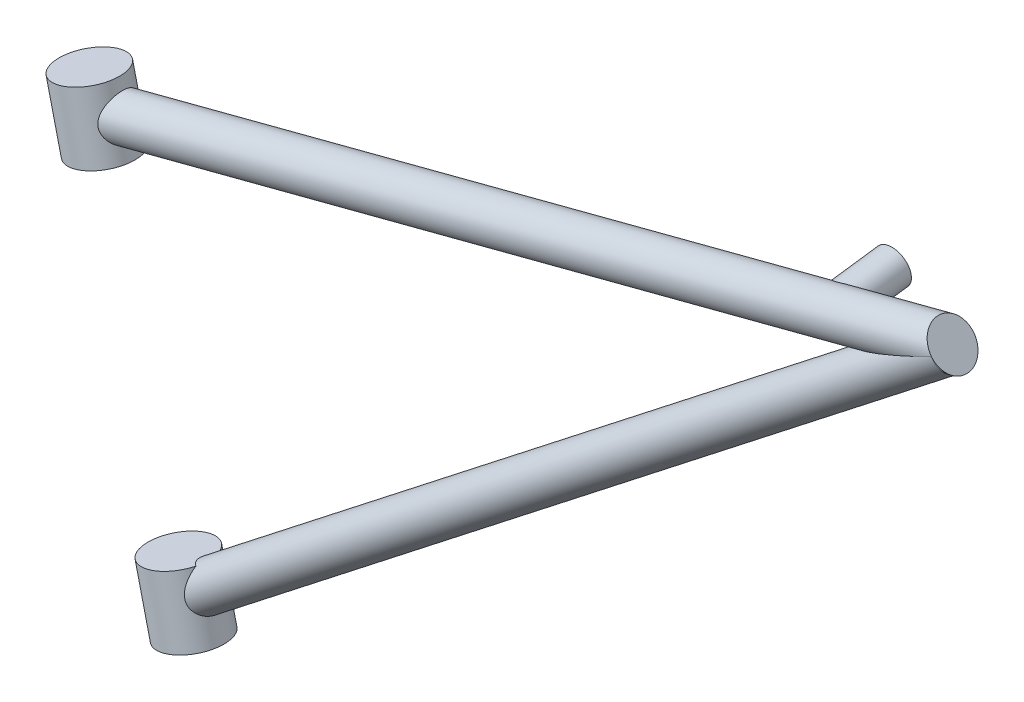
ISO-10303-21;
HEADER;
FILE_DESCRIPTION(('STEP AP214'),'2;1');
FILE_NAME('part.step','',(''),(''),'','','');
FILE_SCHEMA(('AUTOMOTIVE_DESIGN { 1 0 10303 214 1 1 1 1 }'));
ENDSEC;
DATA;
#1=APPLICATION_CONTEXT('core data for automotive mechanical design processes');
#2=APPLICATION_PROTOCOL_DEFINITION('international standard','automotive_design',2000,#1);
#3=PRODUCT_CONTEXT('',#1,'mechanical');
#4=PRODUCT('Part','Part','',(#3));
#5=PRODUCT_RELATED_PRODUCT_CATEGORY('part','',(#4));
#6=PRODUCT_DEFINITION_FORMATION('','',#4);
#7=PRODUCT_DEFINITION_CONTEXT('part definition',#1,'design');
#8=PRODUCT_DEFINITION('design','',#6,#7);
#9=PRODUCT_DEFINITION_SHAPE('','',#8);
#10=(LENGTH_UNIT() NAMED_UNIT(*) SI_UNIT(.MILLI.,.METRE.));
#11=(NAMED_UNIT(*) PLANE_ANGLE_UNIT() SI_UNIT($,.RADIAN.));
#12=(NAMED_UNIT(*) SI_UNIT($,.STERADIAN.) SOLID_ANGLE_UNIT());
#13=UNCERTAINTY_MEASURE_WITH_UNIT(LENGTH_MEASURE(1.E-05),#10,'distance_accuracy_value','');
#14=(GEOMETRIC_REPRESENTATION_CONTEXT(3) GLOBAL_UNCERTAINTY_ASSIGNED_CONTEXT((#13)) GLOBAL_UNIT_ASSIGNED_CONTEXT((#10,
#11,#12)) REPRESENTATION_CONTEXT('',''));
#15=CARTESIAN_POINT('',(0.,0.,0.));
#16=DIRECTION('',(0.,0.,1.));
#17=DIRECTION('',(1.,0.,0.));
#18=AXIS2_PLACEMENT_3D('',#15,#16,#17);
#19=CARTESIAN_POINT('',(215.,1151.6011,-53.649));
#20=DIRECTION('',(0.788508643665139,0.615015858971912,-0.00310033520835739));
#21=DIRECTION('',(-0.615018814783549,0.788512433295911,0.));
#22=AXIS2_PLACEMENT_3D('',#19,#20,#21);
#23=CYLINDRICAL_SURFACE('',#22,9.525);
#24=CARTESIAN_POINT('',(243.39562055654,1173.74893199642,-53.7606486710474));
#25=DIRECTION('',(-0.230684760062267,0.973028498209276,0.000288353283411398));
#26=DIRECTION('',(0.973022198051878,0.230684316193179,-0.00354236655039736));
#27=AXIS2_PLACEMENT_3D('',#24,#25,#26);
#28=ELLIPSE('',#27,22.8674930535986,9.525);
#29=CARTESIAN_POINT('',(224.320634321341,1169.225180437,-48.7995007985226));
#30=VERTEX_POINT('',#29);
#31=CARTESIAN_POINT('',(224.286262085042,1169.21993073521,-58.5827833271125));
#32=VERTEX_POINT('',#31);
#33=EDGE_CURVE('E105',#30,#32,#28,.F.);
#34=ORIENTED_EDGE('',*,*,#33,.F.);
#35=CARTESIAN_POINT('',(224.286262085042,1169.21993073521,-58.5827833271125));
#36=CARTESIAN_POINT('',(224.259857325888,1169.08518369756,-58.7334222265341));
#37=CARTESIAN_POINT('',(224.233039669883,1168.94604086328,-58.8799868131545));
#38=CARTESIAN_POINT('',(224.178991820654,1168.65996638962,-59.1650957687113));
#39=CARTESIAN_POINT('',(224.151761828018,1168.51303845566,-59.3036438886452));
#40=CARTESIAN_POINT('',(224.097330416037,1168.2125631291,-59.5727254876107));
#41=CARTESIAN_POINT('',(224.070129045662,1168.05902930883,-59.7032741781378));
#42=CARTESIAN_POINT('',(224.01607745269,1167.74582344913,-59.9568762347867));
#43=CARTESIAN_POINT('',(223.989227276873,1167.5861506029,-60.0799286101978));
#44=CARTESIAN_POINT('',(223.909708784618,1167.09862159596,-60.4383869338368));
#45=CARTESIAN_POINT('',(223.858116884653,1166.76249561412,-60.6628811966612));
#46=CARTESIAN_POINT('',(223.760795592024,1166.07242209011,-61.0842061784766));
#47=CARTESIAN_POINT('',(223.715069350101,1165.718465111,-61.2810220354276));
#48=CARTESIAN_POINT('',(223.636664786251,1165.0304754153,-61.6302543273577));
#49=CARTESIAN_POINT('',(223.603156724985,1164.69777584187,-61.7851169950369));
#50=CARTESIAN_POINT('',(223.546313161637,1164.02225456936,-62.0730099883752));
#51=CARTESIAN_POINT('',(223.522976398826,1163.67943413039,-62.2060430185345));
#52=CARTESIAN_POINT('',(223.489676812072,1162.9854248798,-62.4497650608225));
#53=CARTESIAN_POINT('',(223.479707198136,1162.63424040913,-62.5604653927971));
#54=CARTESIAN_POINT('',(223.476895189122,1161.92538048244,-62.7582826238399));
#55=CARTESIAN_POINT('',(223.484046705598,1161.56770737875,-62.8454078941737));
#56=CARTESIAN_POINT('',(223.526129800851,1160.72354013421,-63.019632003482));
#57=CARTESIAN_POINT('',(223.569782905443,1160.23511607562,-63.0963815878199));
#58=CARTESIAN_POINT('',(223.673039754559,1159.50421169317,-63.1703509628201));
#59=CARTESIAN_POINT('',(223.713721858204,1159.26100004498,-63.1881497714082));
#60=CARTESIAN_POINT('',(223.808925405596,1158.77656784518,-63.208784261346));
#61=CARTESIAN_POINT('',(223.863446913944,1158.53534730287,-63.21161987285));
#62=CARTESIAN_POINT('',(223.987999226804,1158.0538387664,-63.2009379730411));
#63=CARTESIAN_POINT('',(224.058226605981,1157.81360581606,-63.1872025274816));
#64=CARTESIAN_POINT('',(224.213948087072,1157.33984142985,-63.1417799374408));
#65=CARTESIAN_POINT('',(224.299441506856,1157.10630969509,-63.1100935949197));
#66=CARTESIAN_POINT('',(224.484918597031,1156.64861619958,-63.0279072957908));
#67=CARTESIAN_POINT('',(224.584894816063,1156.4244496964,-62.97741699291));
#68=CARTESIAN_POINT('',(224.797681142944,1155.98766669081,-62.8572366265394));
#69=CARTESIAN_POINT('',(224.910489960448,1155.77504903031,-62.7875484924329));
#70=CARTESIAN_POINT('',(225.128165273432,1155.39502394416,-62.6414190706142));
#71=CARTESIAN_POINT('',(225.231556877416,1155.22571379616,-62.5676942871559));
#72=CARTESIAN_POINT('',(225.44401194002,1154.8971588129,-62.406965429258));
#73=CARTESIAN_POINT('',(225.553077604184,1154.73791794574,-62.319956165241));
#74=CARTESIAN_POINT('',(225.775019094641,1154.42987011107,-62.1331560767408));
#75=CARTESIAN_POINT('',(225.887896113201,1154.28106645417,-62.0333612248764));
#76=CARTESIAN_POINT('',(226.115608918504,1153.99398465869,-61.8215969051118));
#77=CARTESIAN_POINT('',(226.230444940643,1153.85570779608,-61.7096259653097));
#78=CARTESIAN_POINT('',(226.46640898153,1153.58252515966,-61.4679271119184));
#79=CARTESIAN_POINT('',(226.587548762974,1153.44818382824,-61.337573472335));
#80=CARTESIAN_POINT('',(226.82820128942,1153.19075081337,-61.0648374828117));
#81=CARTESIAN_POINT('',(226.947714016948,1153.06765925064,-60.9224550038083));
#82=CARTESIAN_POINT('',(227.183456996661,1152.83235048838,-60.6263657424205));
#83=CARTESIAN_POINT('',(227.29968645648,1152.72013589822,-60.4726562581964));
#84=CARTESIAN_POINT('',(227.527315519424,1152.50626944914,-60.1546736029061));
#85=CARTESIAN_POINT('',(227.63871480492,1152.40461828425,-59.9903997388923));
#86=CARTESIAN_POINT('',(227.873123418797,1152.19569467397,-59.6241829279834));
#87=CARTESIAN_POINT('',(227.995029525822,1152.09024665705,-59.4204877809454));
#88=CARTESIAN_POINT('',(228.228473609432,1151.89287255824,-59.000949780285));
#89=CARTESIAN_POINT('',(228.340010636346,1151.80094771444,-58.7851058168927));
#90=CARTESIAN_POINT('',(228.551008201797,1151.63032006214,-58.3424633826018));
#91=CARTESIAN_POINT('',(228.650465034046,1151.55162130866,-58.1156615794439));
#92=CARTESIAN_POINT('',(228.83572510005,1151.40730238531,-57.6525195071222));
#93=CARTESIAN_POINT('',(228.92152837014,1151.34168218063,-57.416179263345));
#94=CARTESIAN_POINT('',(229.081485830094,1151.22090349209,-56.9251846859305));
#95=CARTESIAN_POINT('',(229.154989456591,1151.16630857725,-56.6701789396034));
#96=CARTESIAN_POINT('',(229.284460401839,1151.07117985988,-56.1531731303483));
#97=CARTESIAN_POINT('',(229.340427068882,1151.0306465799,-55.8911728078801));
#98=CARTESIAN_POINT('',(229.433846047649,1150.963646173,-55.3621714159013));
#99=CARTESIAN_POINT('',(229.471302148862,1150.93717616695,-55.0951713815594));
#100=CARTESIAN_POINT('',(229.527062363931,1150.89830263798,-54.5581687493097));
#101=CARTESIAN_POINT('',(229.545367263428,1150.88589853803,-54.2881662750304));
#102=CARTESIAN_POINT('',(229.562199853024,1150.87535932399,-53.7571259945295));
#103=CARTESIAN_POINT('',(229.561423639708,1150.87672092083,-53.4961198833487));
#104=CARTESIAN_POINT('',(229.54182225614,1150.89250809807,-52.9751874948947));
#105=CARTESIAN_POINT('',(229.522997505866,1150.9069333745,-52.7152611926364));
#106=CARTESIAN_POINT('',(229.467621648065,1150.94883442944,-52.198393218211));
#107=CARTESIAN_POINT('',(229.431072078148,1150.97630907593,-51.9414512891322));
#108=CARTESIAN_POINT('',(229.340854163361,1151.04429691626,-51.4323457186929));
#109=CARTESIAN_POINT('',(229.287185724139,1151.08481018195,-51.1801821036765));
#110=CARTESIAN_POINT('',(229.164114514175,1151.17849155133,-50.684408224491));
#111=CARTESIAN_POINT('',(229.094844818259,1151.23155280478,-50.4407446602848));
#112=CARTESIAN_POINT('',(228.941420982296,1151.35054264559,-49.9613837856289));
#113=CARTESIAN_POINT('',(228.857266934708,1151.41647115302,-49.7256864257047));
#114=CARTESIAN_POINT('',(228.675340927335,1151.56132618532,-49.2636028445119));
#115=CARTESIAN_POINT('',(228.577562843186,1151.64025855868,-49.0372208703685));
#116=CARTESIAN_POINT('',(228.369929673435,1151.81127984121,-48.5952204581985));
#117=CARTESIAN_POINT('',(228.260074308572,1151.90336905461,-48.379602269228));
#118=CARTESIAN_POINT('',(228.025641852722,1152.10472360081,-47.9524464985806));
#119=CARTESIAN_POINT('',(227.900664970458,1152.2145070493,-47.7413721247286));
#120=CARTESIAN_POINT('',(227.641692170489,1152.44898572412,-47.3334870610304));
#121=CARTESIAN_POINT('',(227.507695538429,1152.57368213214,-47.1366775035155));
#122=CARTESIAN_POINT('',(227.233168220124,1152.83848396559,-46.7586981138108));
#123=CARTESIAN_POINT('',(227.092639522964,1152.97858471773,-46.5775235679732));
#124=CARTESIAN_POINT('',(226.807776868606,1153.27482164288,-46.2320765009033));
#125=CARTESIAN_POINT('',(226.663443626362,1153.43095481881,-46.0678008320655));
#126=CARTESIAN_POINT('',(226.398381649131,1153.73220035553,-45.7835229472519));
#127=CARTESIAN_POINT('',(226.277756793015,1153.87476454738,-45.6607174563726));
#128=CARTESIAN_POINT('',(226.038026162807,1154.17157832639,-45.4284949783267));
#129=CARTESIAN_POINT('',(225.918920107725,1154.3258257143,-45.3190754814821));
#130=CARTESIAN_POINT('',(225.68447363856,1154.64583511665,-45.1144618249629));
#131=CARTESIAN_POINT('',(225.56912892202,1154.81158324434,-45.0192509321473));
#132=CARTESIAN_POINT('',(225.344231202539,1155.15444321128,-44.8435327087651));
#133=CARTESIAN_POINT('',(225.234678188904,1155.33155502955,-44.7630253510501));
#134=CARTESIAN_POINT('',(225.022918953883,1155.69734784393,-44.6167956848934));
#135=CARTESIAN_POINT('',(224.920752853279,1155.8860830084,-44.5511505102988));
#136=CARTESIAN_POINT('',(224.726236552822,1156.2731161268,-44.4353515205439));
#137=CARTESIAN_POINT('',(224.633885981681,1156.47141371862,-44.3851971192857));
#138=CARTESIAN_POINT('',(224.460378084522,1156.87601236501,-44.3002130778941));
#139=CARTESIAN_POINT('',(224.379220459273,1157.08231320545,-44.2653830280258));
#140=CARTESIAN_POINT('',(224.228871364813,1157.50114234092,-44.2105340427636));
#141=CARTESIAN_POINT('',(224.159681129355,1157.71367127539,-44.1905166337503));
#142=CARTESIAN_POINT('',(224.024758252432,1158.17268394055,-44.1627261198933));
#143=CARTESIAN_POINT('',(223.960810831434,1158.41981650712,-44.1570163817677));
#144=CARTESIAN_POINT('',(223.84806207577,1158.9173015926,-44.1623562048332));
#145=CARTESIAN_POINT('',(223.799263220286,1159.16765463159,-44.173408507524));
#146=CARTESIAN_POINT('',(223.715527415159,1159.6701047542,-44.2108590866441));
#147=CARTESIAN_POINT('',(223.680624287529,1159.92220459189,-44.2372944252073));
#148=CARTESIAN_POINT('',(223.623333552202,1160.42599160862,-44.3041988677007));
#149=CARTESIAN_POINT('',(223.600950420562,1160.67767860805,-44.3446729823029));
#150=CARTESIAN_POINT('',(223.558780297688,1161.30287687313,-44.4616078378177));
#151=CARTESIAN_POINT('',(223.545694317176,1161.67537289618,-44.5459758038928));
#152=CARTESIAN_POINT('',(223.538808081783,1162.41371197458,-44.7406100397313));
#153=CARTESIAN_POINT('',(223.545016437151,1162.77955198637,-44.8508878516685));
#154=CARTESIAN_POINT('',(223.572366659079,1163.50269049958,-45.0957872402616));
#155=CARTESIAN_POINT('',(223.593520155094,1163.85998212515,-45.230427713817));
#156=CARTESIAN_POINT('',(223.647104845075,1164.56390081036,-45.523302583792));
#157=CARTESIAN_POINT('',(223.679537190931,1164.9105267768,-45.6815393891229));
#158=CARTESIAN_POINT('',(223.756030086726,1165.62330036858,-46.0377397506442));
#159=CARTESIAN_POINT('',(223.800900330001,1165.98819350736,-46.238045206054));
#160=CARTESIAN_POINT('',(223.896881081983,1166.69941202241,-46.6677952406542));
#161=CARTESIAN_POINT('',(223.947988032294,1167.04574782584,-46.897223206772));
#162=CARTESIAN_POINT('',(224.026816912979,1167.5476009186,-47.2640278767862));
#163=CARTESIAN_POINT('',(224.053423020627,1167.7117661915,-47.3899166807251));
#164=CARTESIAN_POINT('',(224.106979674164,1168.03368651719,-47.6495584858503));
#165=CARTESIAN_POINT('',(224.133930170897,1168.19144247162,-47.7833103743365));
#166=CARTESIAN_POINT('',(224.187824471542,1168.5000637803,-48.0591988432474));
#167=CARTESIAN_POINT('',(224.214768147409,1168.65091427743,-48.2013521213038));
#168=CARTESIAN_POINT('',(224.268174197067,1168.94444836238,-48.494074583859));
#169=CARTESIAN_POINT('',(224.294636321789,1169.08712780152,-48.6446479681439));
#170=CARTESIAN_POINT('',(224.320634321341,1169.225180437,-48.7995007985225));
#171=B_SPLINE_CURVE_WITH_KNOTS('',3,(#35,#36,#37,#38,#39,#40,#41,#42,#43,#44,#45,#46,#47,#48,
#49,#50,#51,#52,#53,#54,#55,#56,#57,#58,#59,#60,#61,#62,#63,#64,#65,#66,#67,#68,#69,#70,#71,#72,
#73,#74,#75,#76,#77,#78,#79,#80,#81,#82,#83,#84,#85,#86,#87,#88,#89,#90,#91,#92,#93,#94,#95,#96,
#97,#98,#99,#100,#101,#102,#103,#104,#105,#106,#107,#108,#109,#110,#111,#112,#113,#114,#115,
#116,#117,#118,#119,#120,#121,#122,#123,#124,#125,#126,#127,#128,#129,#130,#131,#132,#133,#134,
#135,#136,#137,#138,#139,#140,#141,#142,#143,#144,#145,#146,#147,#148,#149,#150,#151,#152,#153,
#154,#155,#156,#157,#158,#159,#160,#161,#162,#163,#164,#165,#166,#167,#168,#169,#170),
.UNSPECIFIED.,.F.,.F.,(4,2,2,2,2,2,2,2,2,2,2,2,2,2,2,2,2,2,2,2,2,2,2,2,2,2,2,2,2,2,2,2,2,2,2,2,
2,2,2,2,2,2,2,2,2,2,2,2,2,2,2,2,2,2,2,2,2,2,2,2,2,2,2,2,2,2,2,4),(0.,0.611321113095535,
1.22235382943916,1.83218605530848,2.44209870234858,3.66289333627033,4.88434099855862,
5.98894252437597,7.09340709627896,8.19731043031264,9.30082126350922,10.7844934193151,
11.5255072719035,12.2665245834173,13.0173945439189,13.7682309617921,14.5186824394657,
15.2690585242179,15.9032452299519,16.5376803173909,17.172315741574,17.8070279688859,
18.4752867183988,19.1435526389087,19.8119784806391,20.48044821112,21.2588433186672,
22.0373096468024,22.8160142137429,23.5947167082835,24.4065344178049,25.2183822925518,
26.030063896594,26.8417122016533,27.6237962912566,28.4058621827752,29.1878602430734,
29.9698626134922,30.7454316380738,31.5209958450605,32.296909820138,33.0728417402577,
33.8781372588609,34.6834966314204,35.4886123495505,36.2935778332748,36.963445893815,
37.6331881707954,38.3021353757178,38.971081345498,39.6434233396011,40.3157398923394,
40.9880384679269,41.6604063114264,42.4252747618274,43.19026832305,43.9571126486434,
44.7242309558053,45.8689446439783,47.0141692429464,48.1602859732016,49.3065197888626,
50.561168015951,51.8151037127786,52.4406454213909,53.0660988220636,53.6928400783572,
54.3198967787742),.UNSPECIFIED.);
#172=EDGE_CURVE('E92',#32,#30,#171,.T.);
#173=ORIENTED_EDGE('',*,*,#172,.F.);
#174=EDGE_LOOP('',(#34,#173));
#175=FACE_BOUND('',#174,.T.);
#176=CARTESIAN_POINT('',(558.599999999999,1419.6,-55.));
#177=DIRECTION('',(0.897008226583714,0.442000857679935,-0.00338869463695132));
#178=DIRECTION('',(-0.441999884452041,0.897014466927656,0.00107157215105032));
#179=AXIS2_PLACEMENT_3D('',#176,#177,#178);
#180=ELLIPSE('',#179,9.72785711197768,9.525);
#181=CARTESIAN_POINT('',(558.633464600869,1419.60511105407,-45.4750601577955));
#182=VERTEX_POINT('',#181);
#183=CARTESIAN_POINT('',(558.566535399132,1419.59488894593,-64.5249398422045));
#184=VERTEX_POINT('',#183);
#185=EDGE_CURVE('E99',#182,#184,#180,.T.);
#186=ORIENTED_EDGE('',*,*,#185,.F.);
#187=CARTESIAN_POINT('',(558.599999999999,1419.6,-55.));
#188=DIRECTION('',(-0.441999884452041,0.897014466927656,0.00107157215105032));
#189=DIRECTION('',(0.897008226583714,0.442000857679935,-0.00338869463695132));
#190=AXIS2_PLACEMENT_3D('',#187,#188,#189);
#191=ELLIPSE('',#190,46.8855974220386,9.525);
#192=EDGE_CURVE('E127',#184,#182,#191,.T.);
#193=ORIENTED_EDGE('',*,*,#192,.F.);
#194=EDGE_LOOP('',(#186,#193));
#195=FACE_BOUND('',#194,.T.);
#196=ADVANCED_FACE('F73',(#175,#195),#23,.T.);
#197=CARTESIAN_POINT('',(175.,1320.3211,-53.599));
#198=DIRECTION('',(0.968096795715719,0.250551577091192,-0.00353572369863849));
#199=DIRECTION('',(-0.250553143221362,0.968102847027058,0.));
#200=AXIS2_PLACEMENT_3D('',#197,#198,#199);
#201=CYLINDRICAL_SURFACE('',#200,9.525);
#202=CARTESIAN_POINT('',(504.227133417646,1414.08844154874,-59.5039585938913));
#203=CARTESIAN_POINT('',(504.464857421224,1414.09760181344,-59.5942617891076));
#204=CARTESIAN_POINT('',(504.698635246343,1414.09704385512,-59.6960042397452));
#205=CARTESIAN_POINT('',(505.158113018101,1414.07758848023,-59.9151247973802));
#206=CARTESIAN_POINT('',(505.383800471872,1414.05866386908,-60.0325258669474));
#207=CARTESIAN_POINT('',(505.828650021618,1414.00304260454,-60.2780810291282));
#208=CARTESIAN_POINT('',(506.047766682394,1413.9662435176,-60.4062935357939));
#209=CARTESIAN_POINT('',(506.478509544218,1413.87520224712,-60.6686332997005));
#210=CARTESIAN_POINT('',(506.690139425431,1413.8209687696,-60.8027575760604));
#211=CARTESIAN_POINT('',(507.104176551107,1413.69571051109,-61.0723764204211));
#212=CARTESIAN_POINT('',(507.306656198158,1413.62486392385,-61.2078427628513));
#213=CARTESIAN_POINT('',(507.704642104639,1413.46584911731,-61.4789307124651));
#214=CARTESIAN_POINT('',(507.900147496238,1413.37767875117,-61.6145523368189));
#215=CARTESIAN_POINT('',(508.283169881787,1413.18393498012,-61.8832492852156));
#216=CARTESIAN_POINT('',(508.470708863391,1413.07841400492,-62.0163309720604));
#217=CARTESIAN_POINT('',(508.837612923431,1412.84936345689,-62.2781899580101));
#218=CARTESIAN_POINT('',(509.016979562624,1412.72583734178,-62.4069680777489));
#219=CARTESIAN_POINT('',(509.338268255083,1412.48176400306,-62.6378491110267));
#220=CARTESIAN_POINT('',(509.481570462653,1412.3639373975,-62.7409093586566));
#221=CARTESIAN_POINT('',(509.760722996635,1412.11520919375,-62.9411536418972));
#222=CARTESIAN_POINT('',(509.896574839755,1411.98431027219,-63.0383388739296));
#223=CARTESIAN_POINT('',(510.159865713808,1411.70935264756,-63.2255322235154));
#224=CARTESIAN_POINT('',(510.287300195306,1411.56528692673,-63.3155364652478));
#225=CARTESIAN_POINT('',(510.532395376993,1411.26436366675,-63.4868547010695));
#226=CARTESIAN_POINT('',(510.650061265051,1411.10751300624,-63.5681733145513));
#227=CARTESIAN_POINT('',(510.875492904072,1410.77984332888,-63.7215325717388));
#228=CARTESIAN_POINT('',(510.983147391916,1410.60889987627,-63.7934718632813));
#229=CARTESIAN_POINT('',(511.185791030949,1410.25536127867,-63.925717540538));
#230=CARTESIAN_POINT('',(511.280780053849,1410.07276601569,-63.986023808423));
#231=CARTESIAN_POINT('',(511.456637499662,1409.69748951047,-64.0937224228028));
#232=CARTESIAN_POINT('',(511.537520918168,1409.50481926576,-64.141128513834));
#233=CARTESIAN_POINT('',(511.684104252536,1409.11100176178,-64.2221568134546));
#234=CARTESIAN_POINT('',(511.749806914136,1408.90985604327,-64.2557815155315));
#235=CARTESIAN_POINT('',(511.856308504079,1408.5325779405,-64.3046223106027));
#236=CARTESIAN_POINT('',(511.899381813773,1408.3573436005,-64.321871443067));
#237=CARTESIAN_POINT('',(511.973721604232,1408.00368615671,-64.3459869478745));
#238=CARTESIAN_POINT('',(512.00498854179,1407.82526317656,-64.3528537219469));
#239=CARTESIAN_POINT('',(512.055602484283,1407.46666095736,-64.3563158978737));
#240=CARTESIAN_POINT('',(512.074950380118,1407.2864818506,-64.3529120675252));
#241=CARTESIAN_POINT('',(512.101826296974,1406.92570997803,-64.3361562595861));
#242=CARTESIAN_POINT('',(512.109353932825,1406.74511719894,-64.322803957839));
#243=CARTESIAN_POINT('',(512.112802928815,1406.39049693507,-64.287220594167));
#244=CARTESIAN_POINT('',(512.109084484301,1406.21644273653,-64.2652842674653));
#245=CARTESIAN_POINT('',(512.091181116456,1405.87007672902,-64.2131097556428));
#246=CARTESIAN_POINT('',(512.076992471948,1405.69776556162,-64.1828686213393));
#247=CARTESIAN_POINT('',(512.038589269939,1405.35580542383,-64.1147365490689));
#248=CARTESIAN_POINT('',(512.014374667211,1405.18615646546,-64.0768455765932));
#249=CARTESIAN_POINT('',(511.956405572988,1404.85020680964,-63.9941081184208));
#250=CARTESIAN_POINT('',(511.92264917846,1404.68390678719,-63.9492602460321));
#251=CARTESIAN_POINT('',(511.830195982773,1404.287006881,-63.8334101803039));
#252=CARTESIAN_POINT('',(511.766962612649,1404.05836368966,-63.7592778856306));
#253=CARTESIAN_POINT('',(511.623715404703,1403.61012215204,-63.6005662441758));
#254=CARTESIAN_POINT('',(511.543695588359,1403.39052706167,-63.5159831797571));
#255=CARTESIAN_POINT('',(511.367880695877,1402.96080742594,-63.3382447426897));
#256=CARTESIAN_POINT('',(511.272055056521,1402.75070225379,-63.245072919307));
#257=CARTESIAN_POINT('',(511.065675951189,1402.34098202714,-63.052345098745));
#258=CARTESIAN_POINT('',(510.955124073532,1402.14136584458,-62.9527897906651));
#259=CARTESIAN_POINT('',(510.717833146505,1401.74954560995,-62.7475729338954));
#260=CARTESIAN_POINT('',(510.59084357468,1401.55753369513,-62.6418347805517));
#261=CARTESIAN_POINT('',(510.322505873891,1401.18501739509,-62.4282190800305));
#262=CARTESIAN_POINT('',(510.181154997159,1401.00451522283,-62.3203411266318));
#263=CARTESIAN_POINT('',(509.884150231351,1400.65563643388,-62.1052784936769));
#264=CARTESIAN_POINT('',(509.728511653589,1400.4872471739,-61.9980932007389));
#265=CARTESIAN_POINT('',(509.402301821529,1400.16303342587,-61.7876141429016));
#266=CARTESIAN_POINT('',(509.231737420422,1400.0072032338,-61.6843186228519));
#267=CARTESIAN_POINT('',(508.941746504687,1399.76508109924,-61.5231445562694));
#268=CARTESIAN_POINT('',(508.827163051981,1399.67464699598,-61.4627748398788));
#269=CARTESIAN_POINT('',(508.591555217873,1399.49946917871,-61.346539905743));
#270=CARTESIAN_POINT('',(508.470529454511,1399.41472669453,-61.2906756609967));
#271=CARTESIAN_POINT('',(508.097703942577,1399.17005894491,-61.1322997207909));
#272=CARTESIAN_POINT('',(507.835585891431,1399.01920979432,-61.0386710098056));
#273=CARTESIAN_POINT('',(507.448266374452,1398.82878667622,-60.9341446775483));
#274=CARTESIAN_POINT('',(507.333662452822,1398.77612324068,-60.9070496376951));
#275=CARTESIAN_POINT('',(507.100509290648,1398.67656645546,-60.8603558954626));
#276=CARTESIAN_POINT('',(506.981962058312,1398.6296702242,-60.8407534389973));
#277=CARTESIAN_POINT('',(506.741642740472,1398.5422256507,-60.809892101791));
#278=CARTESIAN_POINT('',(506.619874750246,1398.50166966132,-60.7986231076323));
#279=CARTESIAN_POINT('',(506.373804278831,1398.42728936678,-60.7849094521791));
#280=CARTESIAN_POINT('',(506.249501814245,1398.39346501754,-60.7824647330945));
#281=CARTESIAN_POINT('',(505.999217596685,1398.33282158223,-60.7865103137329));
#282=CARTESIAN_POINT('',(505.873234382173,1398.30600907598,-60.7930089702764));
#283=CARTESIAN_POINT('',(505.620723813514,1398.25952351295,-60.8145984035409));
#284=CARTESIAN_POINT('',(505.494196449798,1398.23985058225,-60.829689332));
#285=CARTESIAN_POINT('',(505.114715889419,1398.19137995815,-60.8869159631019));
#286=CARTESIAN_POINT('',(504.862100671023,1398.17318682648,-60.9409996122268));
#287=CARTESIAN_POINT('',(504.426165118409,1398.16406775843,-61.0562251759843));
#288=CARTESIAN_POINT('',(504.241439811473,1398.16742107208,-61.1121448603233));
#289=CARTESIAN_POINT('',(503.87590836775,1398.18735258708,-61.2338789340225));
#290=CARTESIAN_POINT('',(503.695104447504,1398.20393807753,-61.2996987607585));
#291=CARTESIAN_POINT('',(503.337252333991,1398.2493443746,-61.4385095630142));
#292=CARTESIAN_POINT('',(503.160217582829,1398.27820310506,-61.5115222222538));
#293=CARTESIAN_POINT('',(502.810429779023,1398.34729938977,-61.6621434973295));
#294=CARTESIAN_POINT('',(502.637676491597,1398.38753631856,-61.7397518603578));
#295=CARTESIAN_POINT('',(502.213991645969,1398.50076450117,-61.9356848557358));
#296=CARTESIAN_POINT('',(501.965505566231,1398.58019583578,-62.0556072731854));
#297=CARTESIAN_POINT('',(501.477234046288,1398.76148610384,-62.2963797693576));
#298=CARTESIAN_POINT('',(501.23745267892,1398.86335538215,-62.4172302510724));
#299=CARTESIAN_POINT('',(500.767049849626,1399.08886040367,-62.6558405345828));
#300=CARTESIAN_POINT('',(500.53642050016,1399.2124768821,-62.7736029667099));
#301=CARTESIAN_POINT('',(500.084878577823,1399.48133582709,-63.0027559157075));
#302=CARTESIAN_POINT('',(499.863962274466,1399.62656989533,-63.1141488839246));
#303=CARTESIAN_POINT('',(499.478330739812,1399.90589384394,-63.3050667644227));
#304=CARTESIAN_POINT('',(499.311551175654,1400.03592533882,-63.3863733799085));
#305=CARTESIAN_POINT('',(498.985758471714,1400.3094477709,-63.5415443734318));
#306=CARTESIAN_POINT('',(498.826743752194,1400.45293595287,-63.6154102685434));
#307=CARTESIAN_POINT('',(498.517801396072,1400.75305677074,-63.7540834309529));
#308=CARTESIAN_POINT('',(498.367862453368,1400.90967244754,-63.8189021060296));
#309=CARTESIAN_POINT('',(498.078244382956,1401.23586262595,-63.9380385368987));
#310=CARTESIAN_POINT('',(497.938563318387,1401.40543466877,-63.9923582782467));
#311=CARTESIAN_POINT('',(497.694786588498,1401.72569515505,-64.0804042096174));
#312=CARTESIAN_POINT('',(497.588774983577,1401.87439391407,-64.1160743101301));
#313=CARTESIAN_POINT('',(497.38571419409,1402.17956644362,-64.1784854171322));
#314=CARTESIAN_POINT('',(497.28866316074,1402.3360386,-64.2052282685209));
#315=CARTESIAN_POINT('',(497.104509969661,1402.65597588194,-64.2490649947484));
#316=CARTESIAN_POINT('',(497.017404415121,1402.81943859354,-64.266162171912));
#317=CARTESIAN_POINT('',(496.854045393398,1403.15244341361,-64.2901317998954));
#318=CARTESIAN_POINT('',(496.777792050657,1403.32198559178,-64.2970041334744));
#319=CARTESIAN_POINT('',(496.636673807874,1403.66675002343,-64.3001163138322));
#320=CARTESIAN_POINT('',(496.571862052251,1403.84199452507,-64.2963078632842));
#321=CARTESIAN_POINT('',(496.454761661808,1404.19605918331,-64.2777569588355));
#322=CARTESIAN_POINT('',(496.402473052828,1404.37487934729,-64.263014482374));
#323=CARTESIAN_POINT('',(496.310918601028,1404.73460197962,-64.2226478452308));
#324=CARTESIAN_POINT('',(496.271652101894,1404.91550434256,-64.1970242331066));
#325=CARTESIAN_POINT('',(496.206390712364,1405.27788352842,-64.1351967157314));
#326=CARTESIAN_POINT('',(496.180395304179,1405.45936032864,-64.098993223356));
#327=CARTESIAN_POINT('',(496.143072613608,1405.80832976369,-64.0195212097345));
#328=CARTESIAN_POINT('',(496.130820695203,1405.97588480376,-63.9769527543392));
#329=CARTESIAN_POINT('',(496.117550621356,1406.30922839254,-63.8837189872313));
#330=CARTESIAN_POINT('',(496.116536284536,1406.47501632166,-63.8330509291397));
#331=CARTESIAN_POINT('',(496.125434201399,1406.80378085994,-63.7243072579652));
#332=CARTESIAN_POINT('',(496.135342973822,1406.96675834799,-63.6662340101743));
#333=CARTESIAN_POINT('',(496.165652718867,1407.28920005305,-63.5433923908761));
#334=CARTESIAN_POINT('',(496.186057601152,1407.44866293783,-63.4786215317843));
#335=CARTESIAN_POINT('',(496.26639239162,1407.9460007243,-63.264524043827));
#336=CARTESIAN_POINT('',(496.344719131208,1408.27637344955,-63.1042295778124));
#337=CARTESIAN_POINT('',(496.542916687154,1408.91332146997,-62.7635561500391));
#338=CARTESIAN_POINT('',(496.662821886137,1409.21987681213,-62.5831606501107));
#339=CARTESIAN_POINT('',(496.903759549106,1409.73163943731,-62.2577603043773));
#340=CARTESIAN_POINT('',(497.016557513147,1409.94262291364,-62.1155980120779));
#341=CARTESIAN_POINT('',(497.261025078696,1410.3504090588,-61.8269956535066));
#342=CARTESIAN_POINT('',(497.392703273911,1410.54720520835,-61.6805536635455));
#343=CARTESIAN_POINT('',(497.674102186217,1410.9269061838,-61.3860988721972));
#344=CARTESIAN_POINT('',(497.823855763228,1411.1097846939,-61.238083669999));
#345=CARTESIAN_POINT('',(498.140671769467,1411.46141876628,-60.9439503262498));
#346=CARTESIAN_POINT('',(498.30772837372,1411.63017904702,-60.7978315647925));
#347=CARTESIAN_POINT('',(498.616424989309,1411.91439042919,-60.5461804469524));
#348=CARTESIAN_POINT('',(498.754347578705,1412.03281551934,-60.4394296671448));
#349=CARTESIAN_POINT('',(499.040434507519,1412.26177003995,-60.2312174119313));
#350=CARTESIAN_POINT('',(499.18859980969,1412.3722987262,-60.1297564353118));
#351=CARTESIAN_POINT('',(499.495190894035,1412.58509421305,-59.9349585526683));
#352=CARTESIAN_POINT('',(499.65359029936,1412.68738083707,-59.8416021094039));
#353=CARTESIAN_POINT('',(499.981241564943,1412.88361931759,-59.6660745697566));
#354=CARTESIAN_POINT('',(500.150487522959,1412.97757564184,-59.5838974648055));
#355=CARTESIAN_POINT('',(500.552456209844,1413.18337119967,-59.4125142067721));
#356=CARTESIAN_POINT('',(500.789079405071,1413.29221023282,-59.3284952126582));
#357=CARTESIAN_POINT('',(501.156409911793,1413.44222852847,-59.2296453462099));
#358=CARTESIAN_POINT('',(501.280853824605,1413.49000726052,-59.2012326126408));
#359=CARTESIAN_POINT('',(501.533316785557,1413.58078678755,-59.1546047432049));
#360=CARTESIAN_POINT('',(501.661333960725,1413.62379002893,-59.1363843664829));
#361=CARTESIAN_POINT('',(501.92123154965,1413.70496375561,-59.1109109509762));
#362=CARTESIAN_POINT('',(502.053136100907,1413.74308819219,-59.1037562199541));
#363=CARTESIAN_POINT('',(502.318577524275,1413.81367253491,-59.1011195366422));
#364=CARTESIAN_POINT('',(502.452114472018,1413.84613217752,-59.1056381272536));
#365=CARTESIAN_POINT('',(502.719675870698,1413.90513505561,-59.1261356650601));
#366=CARTESIAN_POINT('',(502.85370053976,1413.93167519329,-59.1421205944775));
#367=CARTESIAN_POINT('',(503.121060946713,1413.9787061127,-59.184768072885));
#368=CARTESIAN_POINT('',(503.254396789227,1413.99919784133,-59.2114289489658));
#369=CARTESIAN_POINT('',(503.529217128899,1414.03544431291,-59.2765479067942));
#370=CARTESIAN_POINT('',(503.670590147457,1414.05074694449,-59.3157221473156));
#371=CARTESIAN_POINT('',(503.950791575762,1414.07459236862,-59.4033149639283));
#372=CARTESIAN_POINT('',(504.089622694072,1414.08314282161,-59.4517229865135));
#373=CARTESIAN_POINT('',(504.227133417646,1414.08844154874,-59.5039585938913));
#374=B_SPLINE_CURVE_WITH_KNOTS('',3,(#202,#203,#204,#205,#206,#207,#208,#209,#210,#211,#212,
#213,#214,#215,#216,#217,#218,#219,#220,#221,#222,#223,#224,#225,#226,#227,#228,#229,#230,#231,
#232,#233,#234,#235,#236,#237,#238,#239,#240,#241,#242,#243,#244,#245,#246,#247,#248,#249,#250,
#251,#252,#253,#254,#255,#256,#257,#258,#259,#260,#261,#262,#263,#264,#265,#266,#267,#268,#269,
#270,#271,#272,#273,#274,#275,#276,#277,#278,#279,#280,#281,#282,#283,#284,#285,#286,#287,#288,
#289,#290,#291,#292,#293,#294,#295,#296,#297,#298,#299,#300,#301,#302,#303,#304,#305,#306,#307,
#308,#309,#310,#311,#312,#313,#314,#315,#316,#317,#318,#319,#320,#321,#322,#323,#324,#325,#326,
#327,#328,#329,#330,#331,#332,#333,#334,#335,#336,#337,#338,#339,#340,#341,#342,#343,#344,#345,
#346,#347,#348,#349,#350,#351,#352,#353,#354,#355,#356,#357,#358,#359,#360,#361,#362,#363,#364,
#365,#366,#367,#368,#369,#370,#371,#372,#373),.UNSPECIFIED.,.T.,.F.,(4,2,2,2,2,2,2,2,2,2,2,2,2,
2,2,2,2,2,2,2,2,2,2,2,2,2,2,2,2,2,2,2,2,2,2,2,2,2,2,2,2,2,2,2,2,2,2,2,2,2,2,2,2,2,2,2,2,2,2,2,2,
2,2,2,2,2,2,2,2,2,2,2,2,2,2,2,2,2,2,2,2,2,2,2,2,4),(0.,0.763163331713257,1.52745836758939,
2.29618598021413,3.06453031637839,3.82498260166175,4.58552918495077,5.34381843244429,
6.10196224932386,6.73807996096408,7.37406769052617,8.01039639396001,8.6463849672297,
9.28875911643069,9.93113977179603,10.5728332966548,11.2144106676283,11.7575383092662,
12.3006449348862,12.8437109606135,13.3867946821283,13.9126704157713,14.4387331391347,
14.9647982356434,15.4909683257324,16.2354998131208,16.9802969182936,17.7265514709605,
18.4727256003795,19.2320246749339,19.9914693017725,20.7501093697554,21.5084029176683,
21.9819994652679,22.4556980181134,23.4006546666214,23.7873475407001,24.1738464113099,
24.559875457012,24.9459019746096,25.3322894460266,25.7186837411913,26.4921924842035,
27.0705738080396,27.6492739594241,28.2297754142358,28.8102449655112,29.6704526784917,
30.5310578174592,31.3909043918963,32.2504177878322,32.9295395671162,33.6085226001182,
34.2866416055687,34.9646322395727,35.5222968650725,36.0798461725328,36.637204479558,
37.1945691773543,37.7544582752279,38.314348528356,38.8742105587291,39.4340507436241,
39.9534136588822,40.4729530525312,40.9923269138291,41.5118943753407,42.6338530383727,
43.7567417079769,44.5905979094858,45.4248348690325,46.2606119320143,47.0961085438393,
47.7281438035598,48.3602385517958,48.9907645794075,49.620950367357,50.4386933772466,
50.8471552055123,51.255406811383,51.6672649260132,52.0791421956348,52.4912345064461,
52.9032622680919,53.3452138884063,53.7866633860129),.UNSPECIFIED.);
#375=CARTESIAN_POINT('',(504.227133417646,1414.08844154874,-59.5039585938913));
#376=VERTEX_POINT('',#375);
#377=EDGE_CURVE('E12',#376,#376,#374,.T.);
#378=ORIENTED_EDGE('',*,*,#377,.F.);
#379=EDGE_LOOP('',(#378));
#380=FACE_BOUND('',#379,.T.);
#381=CARTESIAN_POINT('',(186.358449875382,1333.09959285992,-53.6491999503622));
#382=CARTESIAN_POINT('',(186.357581805738,1333.09936924817,-53.8860568586097));
#383=CARTESIAN_POINT('',(186.352921387654,1333.08902414914,-54.1228779562829));
#384=CARTESIAN_POINT('',(186.336141928165,1333.04828094335,-54.5945068523737));
#385=CARTESIAN_POINT('',(186.324023352325,1333.01788408828,-54.8293147755331));
#386=CARTESIAN_POINT('',(186.292666114835,1332.93755309473,-55.2951172089378));
#387=CARTESIAN_POINT('',(186.273425955695,1332.88761484706,-55.526110906468));
#388=CARTESIAN_POINT('',(186.228361236772,1332.76901114286,-55.9825714129173));
#389=CARTESIAN_POINT('',(186.202536484875,1332.70034513992,-56.2080380603657));
#390=CARTESIAN_POINT('',(186.145145325905,1332.54570964981,-56.6508525754505));
#391=CARTESIAN_POINT('',(186.113609333163,1332.45983157607,-56.8682364289368));
#392=CARTESIAN_POINT('',(186.045493710991,1332.27164581024,-57.2950339080024));
#393=CARTESIAN_POINT('',(186.00891210623,1332.16933168093,-57.5044443708686));
#394=CARTESIAN_POINT('',(185.931611677371,1331.94951339829,-57.9142212421292));
#395=CARTESIAN_POINT('',(185.890894265745,1331.83201442722,-58.1145907046935));
#396=CARTESIAN_POINT('',(185.806239384516,1331.58291939138,-58.5057339536995));
#397=CARTESIAN_POINT('',(185.762300721704,1331.45131809444,-58.6965041398218));
#398=CARTESIAN_POINT('',(185.668207883311,1331.16291156617,-59.0843166682633));
#399=CARTESIAN_POINT('',(185.617847978309,1331.00490627344,-59.2804163396614));
#400=CARTESIAN_POINT('',(185.515822385934,1330.67483630273,-59.6600487913169));
#401=CARTESIAN_POINT('',(185.464156548356,1330.50277000237,-59.8435801169037));
#402=CARTESIAN_POINT('',(185.360844773911,1330.14549946665,-60.197931970596));
#403=CARTESIAN_POINT('',(185.309198975563,1329.96027646621,-60.3687336016283));
#404=CARTESIAN_POINT('',(185.207513427391,1329.57802118981,-60.6969344393526));
#405=CARTESIAN_POINT('',(185.157473194482,1329.38099251812,-60.8543377013953));
#406=CARTESIAN_POINT('',(185.052074145416,1328.94040065302,-61.1819144564466));
#407=CARTESIAN_POINT('',(184.997324603338,1328.69474183357,-61.3494760918669));
#408=CARTESIAN_POINT('',(184.895124717704,1328.18960759521,-61.6650101261469));
#409=CARTESIAN_POINT('',(184.847676144492,1327.93012884571,-61.8129777726354));
#410=CARTESIAN_POINT('',(184.763424911842,1327.39915978738,-62.0881314357339));
#411=CARTESIAN_POINT('',(184.726607184471,1327.12768711447,-62.2153467537986));
#412=CARTESIAN_POINT('',(184.667181423721,1326.57392268385,-62.4479771640655));
#413=CARTESIAN_POINT('',(184.64457385024,1326.29163057629,-62.5533915506263));
#414=CARTESIAN_POINT('',(184.621485123181,1325.80286250974,-62.7131545304106));
#415=CARTESIAN_POINT('',(184.616451088553,1325.59851542322,-62.7734026114947));
#416=CARTESIAN_POINT('',(184.616781271352,1325.18667623677,-62.88151769934));
#417=CARTESIAN_POINT('',(184.622138831213,1324.9791862349,-62.9293926109313));
#418=CARTESIAN_POINT('',(184.644451588589,1324.56250380516,-63.0120817315778));
#419=CARTESIAN_POINT('',(184.661391083203,1324.35331406078,-63.0469135257822));
#420=CARTESIAN_POINT('',(184.707787702243,1323.93447859591,-63.1030109629274));
#421=CARTESIAN_POINT('',(184.737244818194,1323.72483287572,-63.1242766150539));
#422=CARTESIAN_POINT('',(184.809376765781,1323.30562257425,-63.1528835624823));
#423=CARTESIAN_POINT('',(184.852125615775,1323.09606519691,-63.1601452000057));
#424=CARTESIAN_POINT('',(184.950720167319,1322.68004735338,-63.1603045370767));
#425=CARTESIAN_POINT('',(185.006565827107,1322.47358687733,-63.153202282425));
#426=CARTESIAN_POINT('',(185.130725059478,1322.06534813991,-63.124715285959));
#427=CARTESIAN_POINT('',(185.1990452174,1321.86357241537,-63.1033229844382));
#428=CARTESIAN_POINT('',(185.346956732024,1321.46622562205,-63.0466041357607));
#429=CARTESIAN_POINT('',(185.426548259071,1321.27065464711,-63.0112773779979));
#430=CARTESIAN_POINT('',(185.589795585038,1320.89964521409,-62.9300597690826));
#431=CARTESIAN_POINT('',(185.672819955293,1320.72373655515,-62.8850372001994));
#432=CARTESIAN_POINT('',(185.845969463324,1320.37871903053,-62.7838642623975));
#433=CARTESIAN_POINT('',(185.93609722828,1320.20961271594,-62.7277097646059));
#434=CARTESIAN_POINT('',(186.215068504544,1319.71289126492,-62.54329813677));
#435=CARTESIAN_POINT('',(186.412512692632,1319.39584564143,-62.3990866125953));
#436=CARTESIAN_POINT('',(186.765826290244,1318.87052979932,-62.1152121318951));
#437=CARTESIAN_POINT('',(186.919011236763,1318.65554568582,-61.9842838873622));
#438=CARTESIAN_POINT('',(187.228263744508,1318.24098753079,-61.7026174616929));
#439=CARTESIAN_POINT('',(187.384332336723,1318.04141913833,-61.5518720727678));
#440=CARTESIAN_POINT('',(187.696163578207,1317.65729232131,-61.2313067808288));
#441=CARTESIAN_POINT('',(187.851925349499,1317.47275820803,-61.061457000686));
#442=CARTESIAN_POINT('',(188.15984241871,1317.1189504319,-60.7036160437416));
#443=CARTESIAN_POINT('',(188.311998122509,1316.94967504553,-60.5156269208007));
#444=CARTESIAN_POINT('',(188.611258175865,1316.62499302276,-60.1202846008485));
#445=CARTESIAN_POINT('',(188.758302080137,1316.46973067059,-59.9127669583086));
#446=CARTESIAN_POINT('',(189.043006391365,1316.17528054179,-59.4805307218162));
#447=CARTESIAN_POINT('',(189.180666052356,1316.03609404243,-59.2558107634381));
#448=CARTESIAN_POINT('',(189.443583326935,1315.77472067425,-58.7903989265441));
#449=CARTESIAN_POINT('',(189.56886071874,1315.65250656462,-58.5497335795888));
#450=CARTESIAN_POINT('',(189.804496573069,1315.42576218832,-58.0532590524574));
#451=CARTESIAN_POINT('',(189.914858982971,1315.32122724086,-57.7974539050311));
#452=CARTESIAN_POINT('',(190.097360437763,1315.1502664167,-57.3256531481095));
#453=CARTESIAN_POINT('',(190.172709407114,1315.08041316403,-57.1121321695133));
#454=CARTESIAN_POINT('',(190.310988394956,1314.9531980356,-56.6774962166102));
#455=CARTESIAN_POINT('',(190.373920711047,1314.89583384865,-56.4563826561554));
#456=CARTESIAN_POINT('',(190.486204383596,1314.79417399333,-56.0078915180193));
#457=CARTESIAN_POINT('',(190.535561910641,1314.74987238654,-55.7805168382876));
#458=CARTESIAN_POINT('',(190.619775648931,1314.67479620972,-55.3208802448295));
#459=CARTESIAN_POINT('',(190.654631569934,1314.64402191043,-55.088618233383));
#460=CARTESIAN_POINT('',(190.709219506578,1314.59629971111,-54.620094518065));
#461=CARTESIAN_POINT('',(190.728899436158,1314.57939941584,-54.3838218589998));
#462=CARTESIAN_POINT('',(190.752522070303,1314.55982499237,-53.9098999993929));
#463=CARTESIAN_POINT('',(190.756464777017,1314.55715086223,-53.6722507990392));
#464=CARTESIAN_POINT('',(190.74853796159,1314.56606538467,-53.1974797402003));
#465=CARTESIAN_POINT('',(190.736667952536,1314.57765447645,-52.9603578981791));
#466=CARTESIAN_POINT('',(190.697385799487,1314.61494272464,-52.4885342998953));
#467=CARTESIAN_POINT('',(190.669974064182,1314.64064151002,-52.2538324801602));
#468=CARTESIAN_POINT('',(190.60210702458,1314.70404480997,-51.8012890673313));
#469=CARTESIAN_POINT('',(190.562442949291,1314.74101966432,-51.5832251363854));
#470=CARTESIAN_POINT('',(190.470468361588,1314.82691729862,-51.1521053557148));
#471=CARTESIAN_POINT('',(190.418153471505,1314.87584421449,-50.9390512676522));
#472=CARTESIAN_POINT('',(190.301804769865,1314.98516246825,-50.5192623113846));
#473=CARTESIAN_POINT('',(190.23777433869,1315.04555049935,-50.3125256403926));
#474=CARTESIAN_POINT('',(190.098988703125,1315.17732773214,-49.9062127733766));
#475=CARTESIAN_POINT('',(190.024229563262,1315.24872097144,-49.7066392386435));
#476=CARTESIAN_POINT('',(189.859092695624,1315.40779858859,-49.3007311374482));
#477=CARTESIAN_POINT('',(189.767961451142,1315.49630657265,-49.0950262173476));
#478=CARTESIAN_POINT('',(189.575995491525,1315.68492732757,-48.6936144814056));
#479=CARTESIAN_POINT('',(189.475156675702,1315.78504500631,-48.4979119446988));
#480=CARTESIAN_POINT('',(189.26523354595,1315.99640745987,-48.1171153382557));
#481=CARTESIAN_POINT('',(189.156145774544,1316.10765690685,-47.9320257746452));
#482=CARTESIAN_POINT('',(188.931243948177,1316.34086214408,-47.5730060039958));
#483=CARTESIAN_POINT('',(188.815429173267,1316.462819081,-47.3990769956121));
#484=CARTESIAN_POINT('',(188.559595552326,1316.73754646288,-47.0358277650413));
#485=CARTESIAN_POINT('',(188.418671770066,1316.89212314421,-46.8485064696081));
#486=CARTESIAN_POINT('',(188.13219334881,1317.21509488208,-46.4899780943311));
#487=CARTESIAN_POINT('',(187.98663799616,1317.38349207451,-46.3187735140675));
#488=CARTESIAN_POINT('',(187.69335940703,1317.73417382321,-45.993015875013));
#489=CARTESIAN_POINT('',(187.545635360469,1317.9164636812,-45.8384692281109));
#490=CARTESIAN_POINT('',(187.250896297353,1318.29489878848,-45.546893630638));
#491=CARTESIAN_POINT('',(187.10388116203,1318.49104162417,-45.4098616401601));
#492=CARTESIAN_POINT('',(186.711848019207,1319.03983337127,-45.0646876401787));
#493=CARTESIAN_POINT('',(186.470069582025,1319.40614092922,-44.8736949049768));
#494=CARTESIAN_POINT('',(186.128594725721,1319.98579136724,-44.6318338491623));
#495=CARTESIAN_POINT('',(186.0183486621,1320.18393967721,-44.5586753759218));
#496=CARTESIAN_POINT('',(185.807142470588,1320.59017598142,-44.428001535468));
#497=CARTESIAN_POINT('',(185.706180581936,1320.79826207953,-44.3704831980091));
#498=CARTESIAN_POINT('',(185.530685811562,1321.19053640945,-44.2796599099045));
#499=CARTESIAN_POINT('',(185.454481769683,1321.37343182466,-44.2439841214191));
#500=CARTESIAN_POINT('',(185.311718069508,1321.74487735506,-44.1849503604514));
#501=CARTESIAN_POINT('',(185.245156582567,1321.93342638987,-44.1615900502011));
#502=CARTESIAN_POINT('',(185.12276253222,1322.31497282549,-44.1275367958688));
#503=CARTESIAN_POINT('',(185.066923258771,1322.507967359,-44.11683590764));
#504=CARTESIAN_POINT('',(184.966599723133,1322.89717359928,-44.1082177379753));
#505=CARTESIAN_POINT('',(184.92211571741,1323.09338537861,-44.1103007452468));
#506=CARTESIAN_POINT('',(184.844776252853,1323.48730711267,-44.1271574854349));
#507=CARTESIAN_POINT('',(184.811907648939,1323.68501511354,-44.1419168073075));
#508=CARTESIAN_POINT('',(184.757495126135,1324.08065900116,-44.1838093238672));
#509=CARTESIAN_POINT('',(184.735951123118,1324.27859488622,-44.2109424266309));
#510=CARTESIAN_POINT('',(184.70354236532,1324.67351258009,-44.2771572319573));
#511=CARTESIAN_POINT('',(184.692687677242,1324.87049331603,-44.3162501524127));
#512=CARTESIAN_POINT('',(184.68076744278,1325.26222490871,-44.4058469426852));
#513=CARTESIAN_POINT('',(184.679707454993,1325.45697443661,-44.4563572753527));
#514=CARTESIAN_POINT('',(184.687432459972,1325.90937755942,-44.5873846734801));
#515=CARTESIAN_POINT('',(184.699715432589,1326.16571891247,-44.6722531138744));
#516=CARTESIAN_POINT('',(184.737184333095,1326.67067267163,-44.8602330441933));
#517=CARTESIAN_POINT('',(184.762375216181,1326.91928207063,-44.9633515301394));
#518=CARTESIAN_POINT('',(184.822955696175,1327.40770496011,-45.1868747568261));
#519=CARTESIAN_POINT('',(184.858359441897,1327.64750572402,-45.3073033619292));
#520=CARTESIAN_POINT('',(184.936812023289,1328.11684032839,-45.564459999739));
#521=CARTESIAN_POINT('',(184.979860231173,1328.34637501001,-45.701186693695));
#522=CARTESIAN_POINT('',(185.072300087104,1328.79902176096,-45.9933844218682));
#523=CARTESIAN_POINT('',(185.121807668162,1329.02189163759,-46.1491936767173));
#524=CARTESIAN_POINT('',(185.22424037892,1329.45488860031,-46.4766106031539));
#525=CARTESIAN_POINT('',(185.277165647241,1329.66501516887,-46.6482189156703));
#526=CARTESIAN_POINT('',(185.384406200937,1330.07117091901,-47.0066185949464));
#527=CARTESIAN_POINT('',(185.438720168277,1330.26721284094,-47.1933959061554));
#528=CARTESIAN_POINT('',(185.546984847139,1330.64416011972,-47.5819021627384));
#529=CARTESIAN_POINT('',(185.600935430507,1330.82506036979,-47.7836361095697));
#530=CARTESIAN_POINT('',(185.703609981598,1331.15991960414,-48.1890961845373));
#531=CARTESIAN_POINT('',(185.752454295458,1331.31483948368,-48.391997545968));
#532=CARTESIAN_POINT('',(185.84691275443,1331.60840694889,-48.8098351485464));
#533=CARTESIAN_POINT('',(185.8925285236,1331.74706273932,-49.0247652400169));
#534=CARTESIAN_POINT('',(185.979264145823,1332.00667430089,-49.4659537140339));
#535=CARTESIAN_POINT('',(186.020384057609,1332.12763030326,-49.6922119485354));
#536=CARTESIAN_POINT('',(186.096912393674,1332.35026974381,-50.1549758014051));
#537=CARTESIAN_POINT('',(186.132320921415,1332.45195353111,-50.3914812340472));
#538=CARTESIAN_POINT('',(186.19609848046,1332.63387559637,-50.8716561480927));
#539=CARTESIAN_POINT('',(186.22451430816,1332.71425673083,-51.1152650812674));
#540=CARTESIAN_POINT('',(186.273687588887,1332.85311224309,-51.6094271370383));
#541=CARTESIAN_POINT('',(186.294445112961,1332.91158682411,-51.8599801951905));
#542=CARTESIAN_POINT('',(186.327567958921,1333.00548903654,-52.3657615985444));
#543=CARTESIAN_POINT('',(186.339938743977,1333.04093167046,-52.620986788781));
#544=CARTESIAN_POINT('',(186.355851439896,1333.08810419856,-53.1338888977806));
#545=CARTESIAN_POINT('',(186.359394093362,1333.09983608721,-53.3915656084966));
#546=CARTESIAN_POINT('',(186.358449875382,1333.09959285992,-53.6491999503622));
#547=B_SPLINE_CURVE_WITH_KNOTS('',3,(#381,#382,#383,#384,#385,#386,#387,#388,#389,#390,#391,
#392,#393,#394,#395,#396,#397,#398,#399,#400,#401,#402,#403,#404,#405,#406,#407,#408,#409,#410,
#411,#412,#413,#414,#415,#416,#417,#418,#419,#420,#421,#422,#423,#424,#425,#426,#427,#428,#429,
#430,#431,#432,#433,#434,#435,#436,#437,#438,#439,#440,#441,#442,#443,#444,#445,#446,#447,#448,
#449,#450,#451,#452,#453,#454,#455,#456,#457,#458,#459,#460,#461,#462,#463,#464,#465,#466,#467,
#468,#469,#470,#471,#472,#473,#474,#475,#476,#477,#478,#479,#480,#481,#482,#483,#484,#485,#486,
#487,#488,#489,#490,#491,#492,#493,#494,#495,#496,#497,#498,#499,#500,#501,#502,#503,#504,#505,
#506,#507,#508,#509,#510,#511,#512,#513,#514,#515,#516,#517,#518,#519,#520,#521,#522,#523,#524,
#525,#526,#527,#528,#529,#530,#531,#532,#533,#534,#535,#536,#537,#538,#539,#540,#541,#542,#543,
#544,#545,#546),.UNSPECIFIED.,.T.,.F.,(4,2,2,2,2,2,2,2,2,2,2,2,2,2,2,2,2,2,2,2,2,2,2,2,2,2,2,2,
2,2,2,2,2,2,2,2,2,2,2,2,2,2,2,2,2,2,2,2,2,2,2,2,2,2,2,2,2,2,2,2,2,2,2,2,2,2,2,2,2,2,2,2,2,2,2,2,
2,2,2,2,2,2,4),(0.,0.710310532065492,1.42057672855423,2.13099236113728,2.84142872358443,
3.5481874354624,4.25522362907283,4.96201916039265,5.66907783724382,6.43880362490134,
7.20861835119722,7.97955399035221,8.75025545066418,9.65630521078588,10.5625743253641,
11.467552536204,12.3725600343403,13.0113085736469,13.6496480221224,14.2871237154373,
14.924598977121,15.5656897589392,16.2067784965753,16.8482066512131,17.489644500793,
18.0880261108857,18.6866300795514,19.8837448008437,20.766757648491,21.6500925541691,
22.5348286253754,23.4194646379888,24.3123622815724,25.2053308201038,26.0968491514646,
26.9881310708987,27.6982812613551,28.4082999208326,29.1179952971405,29.827704877021,
30.5398395669877,31.2519741597256,31.964130681342,32.6762684766829,33.3496420855111,
34.0232490418869,34.6966619425942,35.3703224970922,36.0949159830459,36.8198169073012,
37.5450233697629,38.2703075902344,39.1117981320394,39.9534189683606,40.7953626089414,
41.6371599197263,43.066682546431,43.7807742086203,44.4947301615389,45.09806308502,
45.7012814404205,46.3041210580419,46.9069742900515,47.509143075325,48.1113073872364,
48.7140382490255,49.3171111460853,50.12683525087,50.9368704324654,51.748033264266,
52.5591295117293,53.3875647966806,54.2160337040368,55.0437435262465,55.8717313916595,
56.6507079843022,57.429289900706,58.2078616446578,58.9864192832424,59.7596156087014,
60.5328047610201,61.3054897682176,62.0781097766562),.UNSPECIFIED.);
#548=CARTESIAN_POINT('',(186.358449875382,1333.09959285992,-53.6491999503622));
#549=VERTEX_POINT('',#548);
#550=EDGE_CURVE('E86',#549,#549,#547,.T.);
#551=ORIENTED_EDGE('',*,*,#550,.F.);
#552=EDGE_LOOP('',(#551));
#553=FACE_BOUND('',#552,.T.);
#554=CARTESIAN_POINT('',(558.600000000001,1419.6,-55.));
#555=DIRECTION('',(0.788508643665139,0.615015858971912,-0.00310033520835738));
#556=DIRECTION('',(0.615013638287672,-0.788514556162628,-0.00173765353659148));
#557=AXIS2_PLACEMENT_3D('',#554,#555,#556);
#558=ELLIPSE('',#557,10.38195969076,9.525);
#559=EDGE_CURVE('E120',#182,#184,#558,.F.);
#560=ORIENTED_EDGE('',*,*,#559,.T.);
#561=ORIENTED_EDGE('',*,*,#192,.T.);
#562=EDGE_LOOP('',(#560,#561));
#563=FACE_BOUND('',#562,.T.);
#564=ADVANCED_FACE('F147',(#380,#553,#563),#201,.T.);
#565=EDGE_CURVE('E116',#184,#182,#558,.F.);
#566=ORIENTED_EDGE('',*,*,#565,.T.);
#567=ORIENTED_EDGE('',*,*,#185,.T.);
#568=EDGE_LOOP('',(#566,#567));
#569=FACE_BOUND('',#568,.T.);
#570=ADVANCED_FACE('F150',(#569),#201,.T.);
#571=CARTESIAN_POINT('',(558.6,1419.6,-55.));
#572=DIRECTION('',(0.788508643665139,0.615015858971912,-0.00310033520835738));
#573=DIRECTION('',(-0.615018814783548,0.788512433295912,0.));
#574=AXIS2_PLACEMENT_3D('',#571,#572,#573);
#575=PLANE('',#574);
#576=ORIENTED_EDGE('',*,*,#559,.F.);
#577=ORIENTED_EDGE('',*,*,#565,.F.);
#578=EDGE_LOOP('',(#576,#577));
#579=FACE_BOUND('',#578,.T.);
#580=ADVANCED_FACE('F75',(#579),#575,.T.);
#581=CARTESIAN_POINT('',(218.460272,1137.00567,-53.6533253));
#582=DIRECTION('',(-0.230684760062267,0.973028498209276,0.000288353283411398));
#583=DIRECTION('',(-0.973028538661778,-0.230684769652712,0.));
#584=AXIS2_PLACEMENT_3D('',#581,#582,#583);
#585=PLANE('',#584);
#586=CARTESIAN_POINT('',(218.460272,1137.00567,-53.6533253));
#587=DIRECTION('',(-0.230684760062267,0.973028498209276,0.000288353283411398));
#588=DIRECTION('',(-0.973028538661778,-0.230684769652712,0.));
#589=AXIS2_PLACEMENT_3D('',#586,#587,#588);
#590=CIRCLE('',#589,14.);
#591=CARTESIAN_POINT('',(204.837872458735,1133.77608322486,-53.6533253));
#592=VERTEX_POINT('',#591);
#593=EDGE_CURVE('E117',#592,#592,#590,.T.);
#594=ORIENTED_EDGE('',*,*,#593,.F.);
#595=EDGE_LOOP('',(#594));
#596=FACE_BOUND('',#595,.T.);
#597=ADVANCED_FACE('F143',(#596),#585,.F.);
#598=CARTESIAN_POINT('',(211.539728,1166.19653,-53.6446747));
#599=DIRECTION('',(-0.230684760062267,0.973028498209276,0.000288353283411398));
#600=DIRECTION('',(-0.973028538661778,-0.230684769652712,0.));
#601=AXIS2_PLACEMENT_3D('',#598,#599,#600);
#602=PLANE('',#601);
#603=CARTESIAN_POINT('',(211.539728,1166.19653,-53.6446747));
#604=DIRECTION('',(-0.230684760062267,0.973028498209276,0.000288353283411398));
#605=DIRECTION('',(-0.973028538661778,-0.230684769652712,0.));
#606=AXIS2_PLACEMENT_3D('',#603,#604,#605);
#607=CIRCLE('',#606,14.);
#608=EDGE_CURVE('E113',#32,#30,#607,.T.);
#609=ORIENTED_EDGE('',*,*,#608,.T.);
#610=ORIENTED_EDGE('',*,*,#33,.T.);
#611=EDGE_LOOP('',(#609,#610));
#612=FACE_BOUND('',#611,.T.);
#613=ADVANCED_FACE('F115',(#612),#602,.T.);
#614=CARTESIAN_POINT('',(218.460272,1137.00567,-53.6533253));
#615=DIRECTION('',(-0.230684760062267,0.973028498209276,0.000288353283411629));
#616=DIRECTION('',(-0.973028538661778,-0.230684769652712,0.));
#617=AXIS2_PLACEMENT_3D('',#614,#615,#616);
#618=CYLINDRICAL_SURFACE('',#617,14.);
#619=ORIENTED_EDGE('',*,*,#608,.F.);
#620=ORIENTED_EDGE('',*,*,#172,.T.);
#621=EDGE_LOOP('',(#619,#620));
#622=FACE_BOUND('',#621,.T.);
#623=ORIENTED_EDGE('',*,*,#593,.T.);
#624=EDGE_LOOP('',(#623));
#625=FACE_BOUND('',#624,.T.);
#626=ADVANCED_FACE('F111',(#622,#625),#618,.T.);
#627=CARTESIAN_POINT('',(178.460272,1305.72567,-53.6033253));
#628=DIRECTION('',(-0.230684760062262,0.973028498209277,0.000288353283412779));
#629=DIRECTION('',(-0.973028538661779,-0.230684769652707,0.));
#630=AXIS2_PLACEMENT_3D('',#627,#628,#629);
#631=PLANE('',#630);
#632=CARTESIAN_POINT('',(178.460272,1305.72567,-53.6033253));
#633=DIRECTION('',(-0.230684760062262,0.973028498209277,0.000288353283412779));
#634=DIRECTION('',(-0.973028538661779,-0.230684769652707,0.));
#635=AXIS2_PLACEMENT_3D('',#632,#633,#634);
#636=CIRCLE('',#635,14.);
#637=CARTESIAN_POINT('',(164.837872458735,1302.49608322486,-53.6033253));
#638=VERTEX_POINT('',#637);
#639=EDGE_CURVE('E308',#638,#638,#636,.T.);
#640=ORIENTED_EDGE('',*,*,#639,.F.);
#641=EDGE_LOOP('',(#640));
#642=FACE_BOUND('',#641,.T.);
#643=ADVANCED_FACE('F139',(#642),#631,.F.);
#644=CARTESIAN_POINT('',(171.539728,1334.91653,-53.5946747));
#645=DIRECTION('',(-0.230684760062262,0.973028498209277,0.000288353283412779));
#646=DIRECTION('',(-0.973028538661779,-0.230684769652707,0.));
#647=AXIS2_PLACEMENT_3D('',#644,#645,#646);
#648=PLANE('',#647);
#649=CARTESIAN_POINT('',(171.539728,1334.91653,-53.5946747));
#650=DIRECTION('',(-0.230684760062262,0.973028498209277,0.000288353283412779));
#651=DIRECTION('',(-0.973028538661779,-0.230684769652707,0.));
#652=AXIS2_PLACEMENT_3D('',#649,#650,#651);
#653=CIRCLE('',#652,14.);
#654=CARTESIAN_POINT('',(157.917328458735,1331.68694322486,-53.5946747));
#655=VERTEX_POINT('',#654);
#656=EDGE_CURVE('E123',#655,#655,#653,.T.);
#657=ORIENTED_EDGE('',*,*,#656,.T.);
#658=EDGE_LOOP('',(#657));
#659=FACE_BOUND('',#658,.T.);
#660=ADVANCED_FACE('F162',(#659),#648,.T.);
#661=CARTESIAN_POINT('',(178.460272,1305.72567,-53.6033253));
#662=DIRECTION('',(-0.230684760062265,0.973028498209276,0.000288353283411627));
#663=DIRECTION('',(-0.973028538661778,-0.23068476965271,0.));
#664=AXIS2_PLACEMENT_3D('',#661,#662,#663);
#665=CYLINDRICAL_SURFACE('',#664,14.);
#666=ORIENTED_EDGE('',*,*,#550,.T.);
#667=EDGE_LOOP('',(#666));
#668=FACE_BOUND('',#667,.T.);
#669=ORIENTED_EDGE('',*,*,#656,.F.);
#670=EDGE_LOOP('',(#669));
#671=FACE_BOUND('',#670,.T.);
#672=ORIENTED_EDGE('',*,*,#639,.T.);
#673=EDGE_LOOP('',(#672));
#674=FACE_BOUND('',#673,.T.);
#675=ADVANCED_FACE('F146',(#668,#671,#674),#665,.T.);
#676=CARTESIAN_POINT('',(503.54,1408.46,-83.29));
#677=DIRECTION('',(-0.0297371961792521,0.100867054716723,-0.994455396906352));
#678=DIRECTION('',(0.,0.994895387610701,0.100911682727782));
#679=AXIS2_PLACEMENT_3D('',#676,#677,#678);
#680=PLANE('',#679);
#681=CARTESIAN_POINT('',(503.54,1408.46,-83.29));
#682=DIRECTION('',(-0.0297371961792521,0.100867054716723,-0.994455396906352));
#683=DIRECTION('',(0.,0.994895387610701,0.100911682727782));
#684=AXIS2_PLACEMENT_3D('',#681,#682,#683);
#685=CIRCLE('',#684,8.00000000000002);
#686=CARTESIAN_POINT('',(503.54,1416.41916310089,-82.4827065381777));
#687=VERTEX_POINT('',#686);
#688=EDGE_CURVE('E307',#687,#687,#685,.T.);
#689=ORIENTED_EDGE('',*,*,#688,.T.);
#690=EDGE_LOOP('',(#689));
#691=FACE_BOUND('',#690,.T.);
#692=ADVANCED_FACE('F161',(#691),#680,.T.);
#693=CARTESIAN_POINT('',(504.391876,1405.57048,-54.8020188));
#694=DIRECTION('',(-0.0297371961792444,0.100867054716708,-0.994455396906354));
#695=DIRECTION('',(0.,0.994895387610703,0.100911682727766));
#696=AXIS2_PLACEMENT_3D('',#693,#694,#695);
#697=CYLINDRICAL_SURFACE('',#696,8.00000000000002);
#698=ORIENTED_EDGE('',*,*,#377,.T.);
#699=EDGE_LOOP('',(#698));
#700=FACE_BOUND('',#699,.T.);
#701=ORIENTED_EDGE('',*,*,#688,.F.);
#702=EDGE_LOOP('',(#701));
#703=FACE_BOUND('',#702,.T.);
#704=ADVANCED_FACE('F170',(#700,#703),#697,.T.);
#705=CLOSED_SHELL('',(#196,#564,#570,#580,#597,#613,#626,#643,#660,#675,#692,#704));
#706=MANIFOLD_SOLID_BREP('B2',#705);
#707=ADVANCED_BREP_SHAPE_REPRESENTATION('',(#18,#706),#14);
#708=SHAPE_DEFINITION_REPRESENTATION(#9,#707);
ENDSEC;
END-ISO-10303-21;
